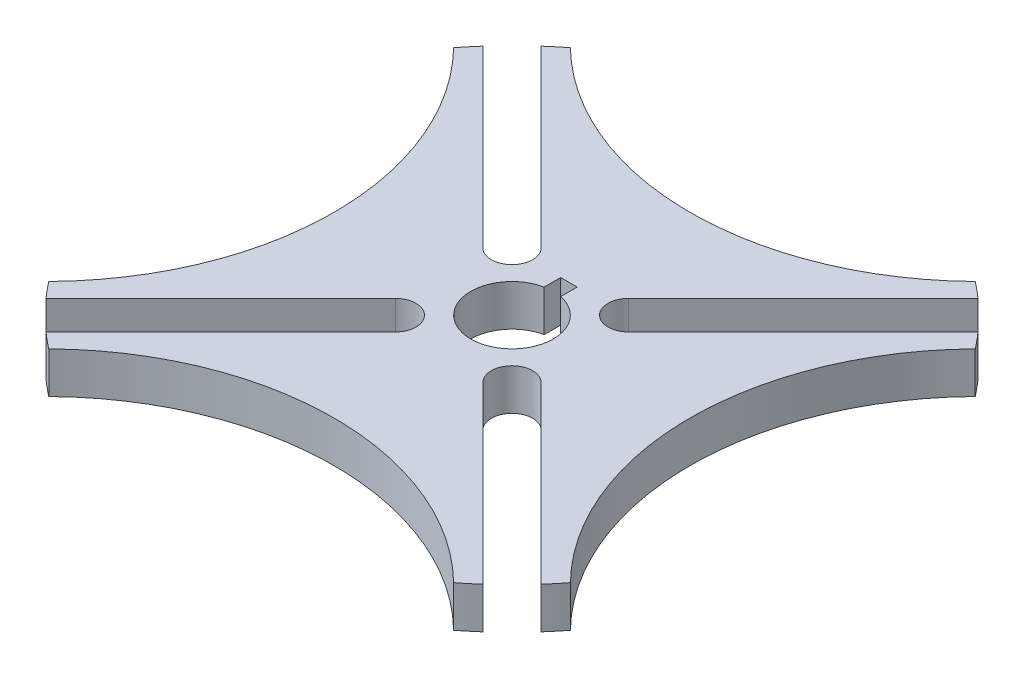
ISO-10303-21;
HEADER;
FILE_DESCRIPTION(('STEP AP214'),'2;1');
FILE_NAME('part.step','',(''),(''),'','','');
FILE_SCHEMA(('AUTOMOTIVE_DESIGN { 1 0 10303 214 1 1 1 1 }'));
ENDSEC;
DATA;
#1=APPLICATION_CONTEXT('core data for automotive mechanical design processes');
#2=APPLICATION_PROTOCOL_DEFINITION('international standard','automotive_design',2000,#1);
#3=PRODUCT_CONTEXT('',#1,'mechanical');
#4=PRODUCT('Part','Part','',(#3));
#5=PRODUCT_RELATED_PRODUCT_CATEGORY('part','',(#4));
#6=PRODUCT_DEFINITION_FORMATION('','',#4);
#7=PRODUCT_DEFINITION_CONTEXT('part definition',#1,'design');
#8=PRODUCT_DEFINITION('design','',#6,#7);
#9=PRODUCT_DEFINITION_SHAPE('','',#8);
#10=(LENGTH_UNIT() NAMED_UNIT(*) SI_UNIT(.MILLI.,.METRE.));
#11=(NAMED_UNIT(*) PLANE_ANGLE_UNIT() SI_UNIT($,.RADIAN.));
#12=(NAMED_UNIT(*) SI_UNIT($,.STERADIAN.) SOLID_ANGLE_UNIT());
#13=UNCERTAINTY_MEASURE_WITH_UNIT(LENGTH_MEASURE(1.E-05),#10,'distance_accuracy_value','');
#14=(GEOMETRIC_REPRESENTATION_CONTEXT(3) GLOBAL_UNCERTAINTY_ASSIGNED_CONTEXT((#13)) GLOBAL_UNIT_ASSIGNED_CONTEXT((#10,
#11,#12)) REPRESENTATION_CONTEXT('',''));
#15=CARTESIAN_POINT('',(0.,0.,0.));
#16=DIRECTION('',(0.,0.,1.));
#17=DIRECTION('',(1.,0.,0.));
#18=AXIS2_PLACEMENT_3D('',#15,#16,#17);
#19=CARTESIAN_POINT('',(0.,10.,0.));
#20=DIRECTION('',(0.,1.,0.));
#21=DIRECTION('',(0.,0.,1.));
#22=AXIS2_PLACEMENT_3D('',#19,#20,#21);
#23=PLANE('',#22);
#24=CARTESIAN_POINT('',(0.,10.,0.));
#25=DIRECTION('',(0.,1.,0.));
#26=DIRECTION('',(0.,0.,1.));
#27=AXIS2_PLACEMENT_3D('',#24,#25,#26);
#28=CIRCLE('',#27,80.);
#29=CARTESIAN_POINT('',(-49.0515513203566,10.,-63.1976685730291));
#30=VERTEX_POINT('',#29);
#31=CARTESIAN_POINT('',(-52.9224150472485,10.,-59.9934828591137));
#32=VERTEX_POINT('',#31);
#33=EDGE_CURVE('E256',#30,#32,#28,.T.);
#34=ORIENTED_EDGE('',*,*,#33,.T.);
#35=DIRECTION('',(0.707106781186551,0.,0.707106781186544));
#36=VECTOR('',#35,1.);
#37=CARTESIAN_POINT('',(-52.9224150472485,10.,-59.9934828591137));
#38=LINE('',#37,#36);
#39=CARTESIAN_POINT('',(-10.6066017177982,10.,-17.6776695296638));
#40=VERTEX_POINT('',#39);
#41=EDGE_CURVE('E259',#32,#40,#38,.T.);
#42=ORIENTED_EDGE('',*,*,#41,.T.);
#43=CARTESIAN_POINT('',(-14.142135623731,10.,-14.1421356237309));
#44=DIRECTION('',(0.,-1.,0.));
#45=DIRECTION('',(0.,0.,1.));
#46=AXIS2_PLACEMENT_3D('',#43,#44,#45);
#47=CIRCLE('',#46,5.00000000000016);
#48=CARTESIAN_POINT('',(-17.6776695296637,10.,-10.6066017177979));
#49=VERTEX_POINT('',#48);
#50=EDGE_CURVE('E262',#40,#49,#47,.T.);
#51=ORIENTED_EDGE('',*,*,#50,.T.);
#52=DIRECTION('',(-0.707106781186547,0.,-0.707106781186548));
#53=VECTOR('',#52,1.);
#54=CARTESIAN_POINT('',(-59.9934828591139,10.,-52.9224150472482));
#55=LINE('',#54,#53);
#56=CARTESIAN_POINT('',(-59.9934828591139,10.,-52.9224150472482));
#57=VERTEX_POINT('',#56);
#58=EDGE_CURVE('E264',#49,#57,#55,.T.);
#59=ORIENTED_EDGE('',*,*,#58,.T.);
#60=CARTESIAN_POINT('',(0.,10.,0.));
#61=DIRECTION('',(0.,1.,0.));
#62=DIRECTION('',(0.,0.,1.));
#63=AXIS2_PLACEMENT_3D('',#60,#61,#62);
#64=CIRCLE('',#63,80.);
#65=CARTESIAN_POINT('',(-63.197668573029,10.,-49.0515513203566));
#66=VERTEX_POINT('',#65);
#67=EDGE_CURVE('E266',#57,#66,#64,.T.);
#68=ORIENTED_EDGE('',*,*,#67,.T.);
#69=CARTESIAN_POINT('',(-113.137085,10.,0.));
#70=DIRECTION('',(0.,-1.,0.));
#71=DIRECTION('',(0.,0.,1.));
#72=AXIS2_PLACEMENT_3D('',#69,#70,#71);
#73=CIRCLE('',#72,70.);
#74=CARTESIAN_POINT('',(-63.197668573029,10.,49.0515513203567));
#75=VERTEX_POINT('',#74);
#76=EDGE_CURVE('E268',#66,#75,#73,.T.);
#77=ORIENTED_EDGE('',*,*,#76,.T.);
#78=CARTESIAN_POINT('',(0.,10.,0.));
#79=DIRECTION('',(0.,1.,0.));
#80=DIRECTION('',(0.,0.,1.));
#81=AXIS2_PLACEMENT_3D('',#78,#79,#80);
#82=CIRCLE('',#81,80.);
#83=CARTESIAN_POINT('',(-59.9934828591143,10.,52.9224150472478));
#84=VERTEX_POINT('',#83);
#85=EDGE_CURVE('E270',#75,#84,#82,.T.);
#86=ORIENTED_EDGE('',*,*,#85,.T.);
#87=DIRECTION('',(0.707106781186553,0.,-0.707106781186542));
#88=VECTOR('',#87,1.);
#89=CARTESIAN_POINT('',(-59.9934828591143,10.,52.9224150472478));
#90=LINE('',#89,#88);
#91=CARTESIAN_POINT('',(-17.6776695296638,10.,10.6066017177981));
#92=VERTEX_POINT('',#91);
#93=EDGE_CURVE('E272',#84,#92,#90,.T.);
#94=ORIENTED_EDGE('',*,*,#93,.T.);
#95=CARTESIAN_POINT('',(-14.1421356237311,10.,14.1421356237308));
#96=DIRECTION('',(0.,-1.,0.));
#97=DIRECTION('',(0.,0.,1.));
#98=AXIS2_PLACEMENT_3D('',#95,#96,#97);
#99=CIRCLE('',#98,5.00000000000001);
#100=CARTESIAN_POINT('',(-10.6066017177984,10.,17.6776695296636));
#101=VERTEX_POINT('',#100);
#102=EDGE_CURVE('E274',#92,#101,#99,.T.);
#103=ORIENTED_EDGE('',*,*,#102,.T.);
#104=DIRECTION('',(-0.707106781186553,0.,0.707106781186542));
#105=VECTOR('',#104,1.);
#106=CARTESIAN_POINT('',(-52.9224150472488,10.,59.9934828591134));
#107=LINE('',#106,#105);
#108=CARTESIAN_POINT('',(-52.9224150472488,10.,59.9934828591134));
#109=VERTEX_POINT('',#108);
#110=EDGE_CURVE('E276',#101,#109,#107,.T.);
#111=ORIENTED_EDGE('',*,*,#110,.T.);
#112=CARTESIAN_POINT('',(0.,10.,0.));
#113=DIRECTION('',(0.,1.,0.));
#114=DIRECTION('',(0.,0.,1.));
#115=AXIS2_PLACEMENT_3D('',#112,#113,#114);
#116=CIRCLE('',#115,80.);
#117=CARTESIAN_POINT('',(-49.0515513203566,10.,63.1976685730291));
#118=VERTEX_POINT('',#117);
#119=EDGE_CURVE('E278',#109,#118,#116,.T.);
#120=ORIENTED_EDGE('',*,*,#119,.T.);
#121=CARTESIAN_POINT('',(0.,10.,113.137085));
#122=DIRECTION('',(0.,-1.,0.));
#123=DIRECTION('',(0.,0.,1.));
#124=AXIS2_PLACEMENT_3D('',#121,#122,#123);
#125=CIRCLE('',#124,70.);
#126=CARTESIAN_POINT('',(49.0515513203566,10.,63.1976685730291));
#127=VERTEX_POINT('',#126);
#128=EDGE_CURVE('E280',#118,#127,#125,.T.);
#129=ORIENTED_EDGE('',*,*,#128,.T.);
#130=CARTESIAN_POINT('',(0.,10.,0.));
#131=DIRECTION('',(0.,1.,0.));
#132=DIRECTION('',(0.,0.,1.));
#133=AXIS2_PLACEMENT_3D('',#130,#131,#132);
#134=CIRCLE('',#133,80.);
#135=CARTESIAN_POINT('',(52.922415047248,10.,59.9934828591141));
#136=VERTEX_POINT('',#135);
#137=EDGE_CURVE('E282',#127,#136,#134,.T.);
#138=ORIENTED_EDGE('',*,*,#137,.T.);
#139=DIRECTION('',(-0.707106781186551,0.,-0.707106781186544));
#140=VECTOR('',#139,1.);
#141=CARTESIAN_POINT('',(52.922415047248,10.,59.9934828591141));
#142=LINE('',#141,#140);
#143=CARTESIAN_POINT('',(10.6066017177977,10.,17.6776695296642));
#144=VERTEX_POINT('',#143);
#145=EDGE_CURVE('E284',#136,#144,#142,.T.);
#146=ORIENTED_EDGE('',*,*,#145,.T.);
#147=CARTESIAN_POINT('',(14.1421356237338,10.,14.1421356237289));
#148=DIRECTION('',(0.,-1.,0.));
#149=DIRECTION('',(0.,0.,1.));
#150=AXIS2_PLACEMENT_3D('',#147,#148,#149);
#151=CIRCLE('',#150,5.00000000000029);
#152=CARTESIAN_POINT('',(17.6776695296664,10.,10.6066017177956));
#153=VERTEX_POINT('',#152);
#154=EDGE_CURVE('E286',#144,#153,#151,.T.);
#155=ORIENTED_EDGE('',*,*,#154,.T.);
#156=DIRECTION('',(0.707106781186544,0.,0.707106781186551));
#157=VECTOR('',#156,1.);
#158=CARTESIAN_POINT('',(59.9934828591136,10.,52.9224150472486));
#159=LINE('',#158,#157);
#160=CARTESIAN_POINT('',(59.9934828591136,10.,52.9224150472486));
#161=VERTEX_POINT('',#160);
#162=EDGE_CURVE('E288',#153,#161,#159,.T.);
#163=ORIENTED_EDGE('',*,*,#162,.T.);
#164=CARTESIAN_POINT('',(0.,10.,0.));
#165=DIRECTION('',(0.,1.,0.));
#166=DIRECTION('',(0.,0.,1.));
#167=AXIS2_PLACEMENT_3D('',#164,#165,#166);
#168=CIRCLE('',#167,80.);
#169=CARTESIAN_POINT('',(63.1976685730288,10.,49.0515513203569));
#170=VERTEX_POINT('',#169);
#171=EDGE_CURVE('E290',#161,#170,#168,.T.);
#172=ORIENTED_EDGE('',*,*,#171,.T.);
#173=CARTESIAN_POINT('',(113.137085,10.,3.95174924900611E-13));
#174=DIRECTION('',(0.,-1.,0.));
#175=DIRECTION('',(0.,0.,1.));
#176=AXIS2_PLACEMENT_3D('',#173,#174,#175);
#177=CIRCLE('',#176,70.);
#178=CARTESIAN_POINT('',(63.1976685730292,10.,-49.0515513203564));
#179=VERTEX_POINT('',#178);
#180=EDGE_CURVE('E292',#170,#179,#177,.T.);
#181=ORIENTED_EDGE('',*,*,#180,.T.);
#182=CARTESIAN_POINT('',(0.,10.,0.));
#183=DIRECTION('',(0.,1.,0.));
#184=DIRECTION('',(0.,0.,1.));
#185=AXIS2_PLACEMENT_3D('',#182,#183,#184);
#186=CIRCLE('',#185,80.);
#187=CARTESIAN_POINT('',(59.9934828591139,10.,-52.9224150472483));
#188=VERTEX_POINT('',#187);
#189=EDGE_CURVE('E294',#179,#188,#186,.T.);
#190=ORIENTED_EDGE('',*,*,#189,.T.);
#191=DIRECTION('',(-0.707106781186548,0.,0.707106781186547));
#192=VECTOR('',#191,1.);
#193=CARTESIAN_POINT('',(59.9934828591139,10.,-52.9224150472483));
#194=LINE('',#193,#192);
#195=CARTESIAN_POINT('',(17.6776695296637,10.,-10.6066017177982));
#196=VERTEX_POINT('',#195);
#197=EDGE_CURVE('E296',#188,#196,#194,.T.);
#198=ORIENTED_EDGE('',*,*,#197,.T.);
#199=CARTESIAN_POINT('',(14.142135623731,10.,-14.1421356237309));
#200=DIRECTION('',(0.,-1.,0.));
#201=DIRECTION('',(0.,0.,1.));
#202=AXIS2_PLACEMENT_3D('',#199,#200,#201);
#203=CIRCLE('',#202,5.00000000000001);
#204=CARTESIAN_POINT('',(10.6066017177982,10.,-17.6776695296637));
#205=VERTEX_POINT('',#204);
#206=EDGE_CURVE('E298',#196,#205,#203,.T.);
#207=ORIENTED_EDGE('',*,*,#206,.T.);
#208=DIRECTION('',(0.707106781186548,0.,-0.707106781186547));
#209=VECTOR('',#208,1.);
#210=CARTESIAN_POINT('',(52.9224150472484,10.,-59.9934828591138));
#211=LINE('',#210,#209);
#212=CARTESIAN_POINT('',(52.9224150472484,10.,-59.9934828591138));
#213=VERTEX_POINT('',#212);
#214=EDGE_CURVE('E300',#205,#213,#211,.T.);
#215=ORIENTED_EDGE('',*,*,#214,.T.);
#216=CARTESIAN_POINT('',(0.,10.,0.));
#217=DIRECTION('',(0.,1.,0.));
#218=DIRECTION('',(0.,0.,1.));
#219=AXIS2_PLACEMENT_3D('',#216,#217,#218);
#220=CIRCLE('',#219,80.);
#221=CARTESIAN_POINT('',(49.0515513203566,10.,-63.1976685730291));
#222=VERTEX_POINT('',#221);
#223=EDGE_CURVE('E302',#213,#222,#220,.T.);
#224=ORIENTED_EDGE('',*,*,#223,.T.);
#225=CARTESIAN_POINT('',(0.,10.,-113.137085));
#226=DIRECTION('',(0.,-1.,0.));
#227=DIRECTION('',(0.,0.,1.));
#228=AXIS2_PLACEMENT_3D('',#225,#226,#227);
#229=CIRCLE('',#228,70.);
#230=EDGE_CURVE('E304',#222,#30,#229,.T.);
#231=ORIENTED_EDGE('',*,*,#230,.T.);
#232=EDGE_LOOP('',(#34,#42,#51,#59,#68,#77,#86,#94,#103,#111,#120,#129,#138,#146,#155,#163,#172,
#181,#190,#198,#207,#215,#224,#231));
#233=FACE_BOUND('',#232,.T.);
#234=DIRECTION('',(0.,0.,-1.));
#235=VECTOR('',#234,1.);
#236=CARTESIAN_POINT('',(2.,10.,-9.79795897113271));
#237=LINE('',#236,#235);
#238=CARTESIAN_POINT('',(2.,10.,-9.79795897113271));
#239=VERTEX_POINT('',#238);
#240=CARTESIAN_POINT('',(2.,10.,-13.7979589711327));
#241=VERTEX_POINT('',#240);
#242=EDGE_CURVE('E228',#239,#241,#237,.T.);
#243=ORIENTED_EDGE('',*,*,#242,.F.);
#244=CARTESIAN_POINT('',(0.,10.,0.));
#245=DIRECTION('',(0.,1.,0.));
#246=DIRECTION('',(0.,0.,1.));
#247=AXIS2_PLACEMENT_3D('',#244,#245,#246);
#248=CIRCLE('',#247,10.);
#249=CARTESIAN_POINT('',(-2.,10.,-9.79795897113271));
#250=VERTEX_POINT('',#249);
#251=EDGE_CURVE('E220',#250,#239,#248,.T.);
#252=ORIENTED_EDGE('',*,*,#251,.F.);
#253=DIRECTION('',(0.,0.,1.));
#254=VECTOR('',#253,1.);
#255=CARTESIAN_POINT('',(-2.,10.,-9.79795897113271));
#256=LINE('',#255,#254);
#257=CARTESIAN_POINT('',(-2.,10.,-13.7979589711327));
#258=VERTEX_POINT('',#257);
#259=EDGE_CURVE('E242',#258,#250,#256,.T.);
#260=ORIENTED_EDGE('',*,*,#259,.F.);
#261=DIRECTION('',(-1.,0.,0.));
#262=VECTOR('',#261,1.);
#263=CARTESIAN_POINT('',(-2.,10.,-13.7979589711327));
#264=LINE('',#263,#262);
#265=EDGE_CURVE('E240',#241,#258,#264,.T.);
#266=ORIENTED_EDGE('',*,*,#265,.F.);
#267=EDGE_LOOP('',(#243,#252,#260,#266));
#268=FACE_BOUND('',#267,.T.);
#269=ADVANCED_FACE('F35',(#233,#268),#23,.T.);
#270=CARTESIAN_POINT('',(0.,0.,0.));
#271=DIRECTION('',(0.,1.,0.));
#272=DIRECTION('',(0.,0.,1.));
#273=AXIS2_PLACEMENT_3D('',#270,#271,#272);
#274=PLANE('',#273);
#275=CARTESIAN_POINT('',(0.,0.,0.));
#276=DIRECTION('',(0.,1.,0.));
#277=DIRECTION('',(0.,0.,1.));
#278=AXIS2_PLACEMENT_3D('',#275,#276,#277);
#279=CIRCLE('',#278,80.);
#280=CARTESIAN_POINT('',(-49.0515513203566,0.,-63.1976685730291));
#281=VERTEX_POINT('',#280);
#282=CARTESIAN_POINT('',(-52.9224150472485,0.,-59.9934828591137));
#283=VERTEX_POINT('',#282);
#284=EDGE_CURVE('E236',#281,#283,#279,.T.);
#285=ORIENTED_EDGE('',*,*,#284,.F.);
#286=CARTESIAN_POINT('',(0.,0.,-113.137085));
#287=DIRECTION('',(0.,-1.,0.));
#288=DIRECTION('',(0.,0.,1.));
#289=AXIS2_PLACEMENT_3D('',#286,#287,#288);
#290=CIRCLE('',#289,70.);
#291=CARTESIAN_POINT('',(49.0515513203566,0.,-63.1976685730291));
#292=VERTEX_POINT('',#291);
#293=EDGE_CURVE('E260',#292,#281,#290,.T.);
#294=ORIENTED_EDGE('',*,*,#293,.F.);
#295=CARTESIAN_POINT('',(0.,0.,0.));
#296=DIRECTION('',(0.,1.,0.));
#297=DIRECTION('',(0.,0.,1.));
#298=AXIS2_PLACEMENT_3D('',#295,#296,#297);
#299=CIRCLE('',#298,80.);
#300=CARTESIAN_POINT('',(52.9224150472484,0.,-59.9934828591138));
#301=VERTEX_POINT('',#300);
#302=EDGE_CURVE('E351',#301,#292,#299,.T.);
#303=ORIENTED_EDGE('',*,*,#302,.F.);
#304=DIRECTION('',(0.707106781186548,0.,-0.707106781186547));
#305=VECTOR('',#304,1.);
#306=CARTESIAN_POINT('',(52.9224150472484,0.,-59.9934828591138));
#307=LINE('',#306,#305);
#308=CARTESIAN_POINT('',(10.6066017177982,0.,-17.6776695296637));
#309=VERTEX_POINT('',#308);
#310=EDGE_CURVE('E349',#309,#301,#307,.T.);
#311=ORIENTED_EDGE('',*,*,#310,.F.);
#312=CARTESIAN_POINT('',(14.142135623731,0.,-14.1421356237309));
#313=DIRECTION('',(0.,-1.,0.));
#314=DIRECTION('',(0.,0.,1.));
#315=AXIS2_PLACEMENT_3D('',#312,#313,#314);
#316=CIRCLE('',#315,5.00000000000001);
#317=CARTESIAN_POINT('',(17.6776695296637,0.,-10.6066017177982));
#318=VERTEX_POINT('',#317);
#319=EDGE_CURVE('E347',#318,#309,#316,.T.);
#320=ORIENTED_EDGE('',*,*,#319,.F.);
#321=DIRECTION('',(-0.707106781186548,0.,0.707106781186547));
#322=VECTOR('',#321,1.);
#323=CARTESIAN_POINT('',(59.9934828591139,0.,-52.9224150472483));
#324=LINE('',#323,#322);
#325=CARTESIAN_POINT('',(59.9934828591139,0.,-52.9224150472483));
#326=VERTEX_POINT('',#325);
#327=EDGE_CURVE('E345',#326,#318,#324,.T.);
#328=ORIENTED_EDGE('',*,*,#327,.F.);
#329=CARTESIAN_POINT('',(0.,0.,0.));
#330=DIRECTION('',(0.,1.,0.));
#331=DIRECTION('',(0.,0.,1.));
#332=AXIS2_PLACEMENT_3D('',#329,#330,#331);
#333=CIRCLE('',#332,80.);
#334=CARTESIAN_POINT('',(63.1976685730292,0.,-49.0515513203564));
#335=VERTEX_POINT('',#334);
#336=EDGE_CURVE('E343',#335,#326,#333,.T.);
#337=ORIENTED_EDGE('',*,*,#336,.F.);
#338=CARTESIAN_POINT('',(113.137085,0.,3.95174924900611E-13));
#339=DIRECTION('',(0.,-1.,0.));
#340=DIRECTION('',(0.,0.,1.));
#341=AXIS2_PLACEMENT_3D('',#338,#339,#340);
#342=CIRCLE('',#341,70.);
#343=CARTESIAN_POINT('',(63.1976685730288,0.,49.0515513203569));
#344=VERTEX_POINT('',#343);
#345=EDGE_CURVE('E341',#344,#335,#342,.T.);
#346=ORIENTED_EDGE('',*,*,#345,.F.);
#347=CARTESIAN_POINT('',(0.,0.,0.));
#348=DIRECTION('',(0.,1.,0.));
#349=DIRECTION('',(0.,0.,1.));
#350=AXIS2_PLACEMENT_3D('',#347,#348,#349);
#351=CIRCLE('',#350,80.);
#352=CARTESIAN_POINT('',(59.9934828591136,0.,52.9224150472486));
#353=VERTEX_POINT('',#352);
#354=EDGE_CURVE('E339',#353,#344,#351,.T.);
#355=ORIENTED_EDGE('',*,*,#354,.F.);
#356=DIRECTION('',(0.707106781186544,0.,0.707106781186551));
#357=VECTOR('',#356,1.);
#358=CARTESIAN_POINT('',(59.9934828591136,0.,52.9224150472486));
#359=LINE('',#358,#357);
#360=CARTESIAN_POINT('',(17.6776695296664,0.,10.6066017177956));
#361=VERTEX_POINT('',#360);
#362=EDGE_CURVE('E337',#361,#353,#359,.T.);
#363=ORIENTED_EDGE('',*,*,#362,.F.);
#364=CARTESIAN_POINT('',(14.1421356237338,0.,14.1421356237289));
#365=DIRECTION('',(0.,-1.,0.));
#366=DIRECTION('',(0.,0.,1.));
#367=AXIS2_PLACEMENT_3D('',#364,#365,#366);
#368=CIRCLE('',#367,5.00000000000029);
#369=CARTESIAN_POINT('',(10.6066017177977,0.,17.6776695296642));
#370=VERTEX_POINT('',#369);
#371=EDGE_CURVE('E335',#370,#361,#368,.T.);
#372=ORIENTED_EDGE('',*,*,#371,.F.);
#373=DIRECTION('',(-0.707106781186551,0.,-0.707106781186544));
#374=VECTOR('',#373,1.);
#375=CARTESIAN_POINT('',(52.922415047248,0.,59.9934828591141));
#376=LINE('',#375,#374);
#377=CARTESIAN_POINT('',(52.922415047248,0.,59.9934828591141));
#378=VERTEX_POINT('',#377);
#379=EDGE_CURVE('E333',#378,#370,#376,.T.);
#380=ORIENTED_EDGE('',*,*,#379,.F.);
#381=CARTESIAN_POINT('',(0.,0.,0.));
#382=DIRECTION('',(0.,1.,0.));
#383=DIRECTION('',(0.,0.,1.));
#384=AXIS2_PLACEMENT_3D('',#381,#382,#383);
#385=CIRCLE('',#384,80.);
#386=CARTESIAN_POINT('',(49.0515513203566,0.,63.1976685730291));
#387=VERTEX_POINT('',#386);
#388=EDGE_CURVE('E331',#387,#378,#385,.T.);
#389=ORIENTED_EDGE('',*,*,#388,.F.);
#390=CARTESIAN_POINT('',(0.,0.,113.137085));
#391=DIRECTION('',(0.,-1.,0.));
#392=DIRECTION('',(0.,0.,1.));
#393=AXIS2_PLACEMENT_3D('',#390,#391,#392);
#394=CIRCLE('',#393,70.);
#395=CARTESIAN_POINT('',(-49.0515513203566,0.,63.1976685730291));
#396=VERTEX_POINT('',#395);
#397=EDGE_CURVE('E329',#396,#387,#394,.T.);
#398=ORIENTED_EDGE('',*,*,#397,.F.);
#399=CARTESIAN_POINT('',(0.,0.,0.));
#400=DIRECTION('',(0.,1.,0.));
#401=DIRECTION('',(0.,0.,1.));
#402=AXIS2_PLACEMENT_3D('',#399,#400,#401);
#403=CIRCLE('',#402,80.);
#404=CARTESIAN_POINT('',(-52.9224150472488,0.,59.9934828591134));
#405=VERTEX_POINT('',#404);
#406=EDGE_CURVE('E327',#405,#396,#403,.T.);
#407=ORIENTED_EDGE('',*,*,#406,.F.);
#408=DIRECTION('',(-0.707106781186553,0.,0.707106781186542));
#409=VECTOR('',#408,1.);
#410=CARTESIAN_POINT('',(-52.9224150472488,0.,59.9934828591134));
#411=LINE('',#410,#409);
#412=CARTESIAN_POINT('',(-10.6066017177984,0.,17.6776695296636));
#413=VERTEX_POINT('',#412);
#414=EDGE_CURVE('E325',#413,#405,#411,.T.);
#415=ORIENTED_EDGE('',*,*,#414,.F.);
#416=CARTESIAN_POINT('',(-14.1421356237311,0.,14.1421356237308));
#417=DIRECTION('',(0.,-1.,0.));
#418=DIRECTION('',(0.,0.,1.));
#419=AXIS2_PLACEMENT_3D('',#416,#417,#418);
#420=CIRCLE('',#419,5.00000000000001);
#421=CARTESIAN_POINT('',(-17.6776695296638,0.,10.6066017177981));
#422=VERTEX_POINT('',#421);
#423=EDGE_CURVE('E323',#422,#413,#420,.T.);
#424=ORIENTED_EDGE('',*,*,#423,.F.);
#425=DIRECTION('',(0.707106781186553,0.,-0.707106781186542));
#426=VECTOR('',#425,1.);
#427=CARTESIAN_POINT('',(-59.9934828591143,0.,52.9224150472478));
#428=LINE('',#427,#426);
#429=CARTESIAN_POINT('',(-59.9934828591143,0.,52.9224150472478));
#430=VERTEX_POINT('',#429);
#431=EDGE_CURVE('E321',#430,#422,#428,.T.);
#432=ORIENTED_EDGE('',*,*,#431,.F.);
#433=CARTESIAN_POINT('',(0.,0.,0.));
#434=DIRECTION('',(0.,1.,0.));
#435=DIRECTION('',(0.,0.,1.));
#436=AXIS2_PLACEMENT_3D('',#433,#434,#435);
#437=CIRCLE('',#436,80.);
#438=CARTESIAN_POINT('',(-63.197668573029,0.,49.0515513203567));
#439=VERTEX_POINT('',#438);
#440=EDGE_CURVE('E319',#439,#430,#437,.T.);
#441=ORIENTED_EDGE('',*,*,#440,.F.);
#442=CARTESIAN_POINT('',(-113.137085,0.,0.));
#443=DIRECTION('',(0.,-1.,0.));
#444=DIRECTION('',(0.,0.,1.));
#445=AXIS2_PLACEMENT_3D('',#442,#443,#444);
#446=CIRCLE('',#445,70.);
#447=CARTESIAN_POINT('',(-63.197668573029,0.,-49.0515513203566));
#448=VERTEX_POINT('',#447);
#449=EDGE_CURVE('E317',#448,#439,#446,.T.);
#450=ORIENTED_EDGE('',*,*,#449,.F.);
#451=CARTESIAN_POINT('',(0.,0.,0.));
#452=DIRECTION('',(0.,1.,0.));
#453=DIRECTION('',(0.,0.,1.));
#454=AXIS2_PLACEMENT_3D('',#451,#452,#453);
#455=CIRCLE('',#454,80.);
#456=CARTESIAN_POINT('',(-59.9934828591139,0.,-52.9224150472482));
#457=VERTEX_POINT('',#456);
#458=EDGE_CURVE('E315',#457,#448,#455,.T.);
#459=ORIENTED_EDGE('',*,*,#458,.F.);
#460=DIRECTION('',(-0.707106781186547,0.,-0.707106781186548));
#461=VECTOR('',#460,1.);
#462=CARTESIAN_POINT('',(-59.9934828591139,0.,-52.9224150472482));
#463=LINE('',#462,#461);
#464=CARTESIAN_POINT('',(-17.6776695296637,0.,-10.6066017177979));
#465=VERTEX_POINT('',#464);
#466=EDGE_CURVE('E313',#465,#457,#463,.T.);
#467=ORIENTED_EDGE('',*,*,#466,.F.);
#468=CARTESIAN_POINT('',(-14.142135623731,0.,-14.1421356237309));
#469=DIRECTION('',(0.,-1.,0.));
#470=DIRECTION('',(0.,0.,1.));
#471=AXIS2_PLACEMENT_3D('',#468,#469,#470);
#472=CIRCLE('',#471,5.00000000000016);
#473=CARTESIAN_POINT('',(-10.6066017177982,0.,-17.6776695296638));
#474=VERTEX_POINT('',#473);
#475=EDGE_CURVE('E311',#474,#465,#472,.T.);
#476=ORIENTED_EDGE('',*,*,#475,.F.);
#477=DIRECTION('',(0.707106781186551,0.,0.707106781186544));
#478=VECTOR('',#477,1.);
#479=CARTESIAN_POINT('',(-52.9224150472485,0.,-59.9934828591137));
#480=LINE('',#479,#478);
#481=EDGE_CURVE('E309',#283,#474,#480,.T.);
#482=ORIENTED_EDGE('',*,*,#481,.F.);
#483=EDGE_LOOP('',(#285,#294,#303,#311,#320,#328,#337,#346,#355,#363,#372,#380,#389,#398,#407,
#415,#424,#432,#441,#450,#459,#467,#476,#482));
#484=FACE_BOUND('',#483,.T.);
#485=CARTESIAN_POINT('',(0.,0.,0.));
#486=DIRECTION('',(0.,1.,0.));
#487=DIRECTION('',(0.,0.,1.));
#488=AXIS2_PLACEMENT_3D('',#485,#486,#487);
#489=CIRCLE('',#488,10.);
#490=CARTESIAN_POINT('',(-2.,0.,-9.79795897113271));
#491=VERTEX_POINT('',#490);
#492=CARTESIAN_POINT('',(2.,0.,-9.79795897113271));
#493=VERTEX_POINT('',#492);
#494=EDGE_CURVE('E58',#491,#493,#489,.T.);
#495=ORIENTED_EDGE('',*,*,#494,.T.);
#496=DIRECTION('',(0.,0.,-1.));
#497=VECTOR('',#496,1.);
#498=CARTESIAN_POINT('',(2.,0.,-9.79795897113271));
#499=LINE('',#498,#497);
#500=CARTESIAN_POINT('',(2.,0.,-13.7979589711327));
#501=VERTEX_POINT('',#500);
#502=EDGE_CURVE('E235',#493,#501,#499,.T.);
#503=ORIENTED_EDGE('',*,*,#502,.T.);
#504=DIRECTION('',(-1.,0.,0.));
#505=VECTOR('',#504,1.);
#506=CARTESIAN_POINT('',(-2.,0.,-13.7979589711327));
#507=LINE('',#506,#505);
#508=CARTESIAN_POINT('',(-2.,0.,-13.7979589711327));
#509=VERTEX_POINT('',#508);
#510=EDGE_CURVE('E248',#501,#509,#507,.T.);
#511=ORIENTED_EDGE('',*,*,#510,.T.);
#512=DIRECTION('',(0.,0.,1.));
#513=VECTOR('',#512,1.);
#514=CARTESIAN_POINT('',(-2.,0.,-9.79795897113271));
#515=LINE('',#514,#513);
#516=EDGE_CURVE('E229',#509,#491,#515,.T.);
#517=ORIENTED_EDGE('',*,*,#516,.T.);
#518=EDGE_LOOP('',(#495,#503,#511,#517));
#519=FACE_BOUND('',#518,.T.);
#520=ADVANCED_FACE('F429',(#484,#519),#274,.F.);
#521=CARTESIAN_POINT('',(0.,10.,0.));
#522=DIRECTION('',(0.,-1.,0.));
#523=DIRECTION('',(0.,0.,-1.));
#524=AXIS2_PLACEMENT_3D('',#521,#522,#523);
#525=CYLINDRICAL_SURFACE('',#524,80.);
#526=ORIENTED_EDGE('',*,*,#284,.T.);
#527=DIRECTION('',(0.,-1.,0.));
#528=VECTOR('',#527,1.);
#529=CARTESIAN_POINT('',(-52.9224150472485,10.,-59.9934828591137));
#530=LINE('',#529,#528);
#531=EDGE_CURVE('E11',#32,#283,#530,.T.);
#532=ORIENTED_EDGE('',*,*,#531,.F.);
#533=ORIENTED_EDGE('',*,*,#33,.F.);
#534=DIRECTION('',(0.,-1.,0.));
#535=VECTOR('',#534,1.);
#536=CARTESIAN_POINT('',(-49.0515513203566,10.,-63.1976685730291));
#537=LINE('',#536,#535);
#538=EDGE_CURVE('E306',#30,#281,#537,.T.);
#539=ORIENTED_EDGE('',*,*,#538,.T.);
#540=EDGE_LOOP('',(#526,#532,#533,#539));
#541=FACE_BOUND('',#540,.T.);
#542=ADVANCED_FACE('F37',(#541),#525,.T.);
#543=CARTESIAN_POINT('',(-52.9224150472485,10.,-59.9934828591137));
#544=DIRECTION('',(0.707106781186544,0.,-0.707106781186551));
#545=DIRECTION('',(-0.707106781186551,0.,-0.707106781186544));
#546=AXIS2_PLACEMENT_3D('',#543,#544,#545);
#547=PLANE('',#546);
#548=ORIENTED_EDGE('',*,*,#481,.T.);
#549=DIRECTION('',(0.,-1.,0.));
#550=VECTOR('',#549,1.);
#551=CARTESIAN_POINT('',(-10.6066017177982,10.,-17.6776695296638));
#552=LINE('',#551,#550);
#553=EDGE_CURVE('E43',#40,#474,#552,.T.);
#554=ORIENTED_EDGE('',*,*,#553,.F.);
#555=ORIENTED_EDGE('',*,*,#41,.F.);
#556=ORIENTED_EDGE('',*,*,#531,.T.);
#557=EDGE_LOOP('',(#548,#554,#555,#556));
#558=FACE_BOUND('',#557,.T.);
#559=ADVANCED_FACE('F446',(#558),#547,.F.);
#560=CARTESIAN_POINT('',(-14.142135623731,10.,-14.1421356237309));
#561=DIRECTION('',(0.,-1.,0.));
#562=DIRECTION('',(0.,0.,-1.));
#563=AXIS2_PLACEMENT_3D('',#560,#561,#562);
#564=CYLINDRICAL_SURFACE('',#563,5.00000000000016);
#565=ORIENTED_EDGE('',*,*,#475,.T.);
#566=DIRECTION('',(0.,-1.,0.));
#567=VECTOR('',#566,1.);
#568=CARTESIAN_POINT('',(-17.6776695296637,10.,-10.6066017177979));
#569=LINE('',#568,#567);
#570=EDGE_CURVE('E416',#49,#465,#569,.T.);
#571=ORIENTED_EDGE('',*,*,#570,.F.);
#572=ORIENTED_EDGE('',*,*,#50,.F.);
#573=ORIENTED_EDGE('',*,*,#553,.T.);
#574=EDGE_LOOP('',(#565,#571,#572,#573));
#575=FACE_BOUND('',#574,.T.);
#576=ADVANCED_FACE('F423',(#575),#564,.F.);
#577=CARTESIAN_POINT('',(-59.9934828591139,10.,-52.9224150472482));
#578=DIRECTION('',(-0.707106781186548,0.,0.707106781186547));
#579=DIRECTION('',(0.707106781186547,0.,0.707106781186548));
#580=AXIS2_PLACEMENT_3D('',#577,#578,#579);
#581=PLANE('',#580);
#582=ORIENTED_EDGE('',*,*,#466,.T.);
#583=DIRECTION('',(0.,-1.,0.));
#584=VECTOR('',#583,1.);
#585=CARTESIAN_POINT('',(-59.9934828591139,10.,-52.9224150472482));
#586=LINE('',#585,#584);
#587=EDGE_CURVE('E413',#57,#457,#586,.T.);
#588=ORIENTED_EDGE('',*,*,#587,.F.);
#589=ORIENTED_EDGE('',*,*,#58,.F.);
#590=ORIENTED_EDGE('',*,*,#570,.T.);
#591=EDGE_LOOP('',(#582,#588,#589,#590));
#592=FACE_BOUND('',#591,.T.);
#593=ADVANCED_FACE('F435',(#592),#581,.F.);
#594=CARTESIAN_POINT('',(0.,10.,0.));
#595=DIRECTION('',(0.,-1.,0.));
#596=DIRECTION('',(0.,0.,-1.));
#597=AXIS2_PLACEMENT_3D('',#594,#595,#596);
#598=CYLINDRICAL_SURFACE('',#597,80.);
#599=ORIENTED_EDGE('',*,*,#458,.T.);
#600=DIRECTION('',(0.,-1.,0.));
#601=VECTOR('',#600,1.);
#602=CARTESIAN_POINT('',(-63.197668573029,10.,-49.0515513203566));
#603=LINE('',#602,#601);
#604=EDGE_CURVE('E410',#66,#448,#603,.T.);
#605=ORIENTED_EDGE('',*,*,#604,.F.);
#606=ORIENTED_EDGE('',*,*,#67,.F.);
#607=ORIENTED_EDGE('',*,*,#587,.T.);
#608=EDGE_LOOP('',(#599,#605,#606,#607));
#609=FACE_BOUND('',#608,.T.);
#610=ADVANCED_FACE('F439',(#609),#598,.T.);
#611=CARTESIAN_POINT('',(-113.137085,10.,0.));
#612=DIRECTION('',(0.,-1.,0.));
#613=DIRECTION('',(0.,0.,-1.));
#614=AXIS2_PLACEMENT_3D('',#611,#612,#613);
#615=CYLINDRICAL_SURFACE('',#614,70.);
#616=ORIENTED_EDGE('',*,*,#449,.T.);
#617=DIRECTION('',(0.,-1.,0.));
#618=VECTOR('',#617,1.);
#619=CARTESIAN_POINT('',(-63.197668573029,10.,49.0515513203567));
#620=LINE('',#619,#618);
#621=EDGE_CURVE('E407',#75,#439,#620,.T.);
#622=ORIENTED_EDGE('',*,*,#621,.F.);
#623=ORIENTED_EDGE('',*,*,#76,.F.);
#624=ORIENTED_EDGE('',*,*,#604,.T.);
#625=EDGE_LOOP('',(#616,#622,#623,#624));
#626=FACE_BOUND('',#625,.T.);
#627=ADVANCED_FACE('F539',(#626),#615,.F.);
#628=CARTESIAN_POINT('',(0.,10.,0.));
#629=DIRECTION('',(0.,-1.,0.));
#630=DIRECTION('',(0.,0.,-1.));
#631=AXIS2_PLACEMENT_3D('',#628,#629,#630);
#632=CYLINDRICAL_SURFACE('',#631,80.);
#633=ORIENTED_EDGE('',*,*,#440,.T.);
#634=DIRECTION('',(0.,-1.,0.));
#635=VECTOR('',#634,1.);
#636=CARTESIAN_POINT('',(-59.9934828591143,10.,52.9224150472478));
#637=LINE('',#636,#635);
#638=EDGE_CURVE('E404',#84,#430,#637,.T.);
#639=ORIENTED_EDGE('',*,*,#638,.F.);
#640=ORIENTED_EDGE('',*,*,#85,.F.);
#641=ORIENTED_EDGE('',*,*,#621,.T.);
#642=EDGE_LOOP('',(#633,#639,#640,#641));
#643=FACE_BOUND('',#642,.T.);
#644=ADVANCED_FACE('F537',(#643),#632,.T.);
#645=CARTESIAN_POINT('',(-59.9934828591143,10.,52.9224150472478));
#646=DIRECTION('',(-0.707106781186542,0.,-0.707106781186553));
#647=DIRECTION('',(-0.707106781186553,0.,0.707106781186542));
#648=AXIS2_PLACEMENT_3D('',#645,#646,#647);
#649=PLANE('',#648);
#650=ORIENTED_EDGE('',*,*,#431,.T.);
#651=DIRECTION('',(0.,-1.,0.));
#652=VECTOR('',#651,1.);
#653=CARTESIAN_POINT('',(-17.6776695296638,10.,10.6066017177981));
#654=LINE('',#653,#652);
#655=EDGE_CURVE('E401',#92,#422,#654,.T.);
#656=ORIENTED_EDGE('',*,*,#655,.F.);
#657=ORIENTED_EDGE('',*,*,#93,.F.);
#658=ORIENTED_EDGE('',*,*,#638,.T.);
#659=EDGE_LOOP('',(#650,#656,#657,#658));
#660=FACE_BOUND('',#659,.T.);
#661=ADVANCED_FACE('F533',(#660),#649,.F.);
#662=CARTESIAN_POINT('',(-14.1421356237311,10.,14.1421356237308));
#663=DIRECTION('',(0.,-1.,0.));
#664=DIRECTION('',(0.,0.,-1.));
#665=AXIS2_PLACEMENT_3D('',#662,#663,#664);
#666=CYLINDRICAL_SURFACE('',#665,5.00000000000001);
#667=ORIENTED_EDGE('',*,*,#423,.T.);
#668=DIRECTION('',(0.,-1.,0.));
#669=VECTOR('',#668,1.);
#670=CARTESIAN_POINT('',(-10.6066017177984,10.,17.6776695296636));
#671=LINE('',#670,#669);
#672=EDGE_CURVE('E398',#101,#413,#671,.T.);
#673=ORIENTED_EDGE('',*,*,#672,.F.);
#674=ORIENTED_EDGE('',*,*,#102,.F.);
#675=ORIENTED_EDGE('',*,*,#655,.T.);
#676=EDGE_LOOP('',(#667,#673,#674,#675));
#677=FACE_BOUND('',#676,.T.);
#678=ADVANCED_FACE('F528',(#677),#666,.F.);
#679=CARTESIAN_POINT('',(-52.9224150472488,10.,59.9934828591134));
#680=DIRECTION('',(0.707106781186542,0.,0.707106781186553));
#681=DIRECTION('',(0.707106781186553,0.,-0.707106781186542));
#682=AXIS2_PLACEMENT_3D('',#679,#680,#681);
#683=PLANE('',#682);
#684=ORIENTED_EDGE('',*,*,#414,.T.);
#685=DIRECTION('',(0.,-1.,0.));
#686=VECTOR('',#685,1.);
#687=CARTESIAN_POINT('',(-52.9224150472488,10.,59.9934828591134));
#688=LINE('',#687,#686);
#689=EDGE_CURVE('E395',#109,#405,#688,.T.);
#690=ORIENTED_EDGE('',*,*,#689,.F.);
#691=ORIENTED_EDGE('',*,*,#110,.F.);
#692=ORIENTED_EDGE('',*,*,#672,.T.);
#693=EDGE_LOOP('',(#684,#690,#691,#692));
#694=FACE_BOUND('',#693,.T.);
#695=ADVANCED_FACE('F522',(#694),#683,.F.);
#696=CARTESIAN_POINT('',(0.,10.,0.));
#697=DIRECTION('',(0.,-1.,0.));
#698=DIRECTION('',(0.,0.,-1.));
#699=AXIS2_PLACEMENT_3D('',#696,#697,#698);
#700=CYLINDRICAL_SURFACE('',#699,80.);
#701=ORIENTED_EDGE('',*,*,#406,.T.);
#702=DIRECTION('',(0.,-1.,0.));
#703=VECTOR('',#702,1.);
#704=CARTESIAN_POINT('',(-49.0515513203566,10.,63.1976685730291));
#705=LINE('',#704,#703);
#706=EDGE_CURVE('E392',#118,#396,#705,.T.);
#707=ORIENTED_EDGE('',*,*,#706,.F.);
#708=ORIENTED_EDGE('',*,*,#119,.F.);
#709=ORIENTED_EDGE('',*,*,#689,.T.);
#710=EDGE_LOOP('',(#701,#707,#708,#709));
#711=FACE_BOUND('',#710,.T.);
#712=ADVANCED_FACE('F518',(#711),#700,.T.);
#713=CARTESIAN_POINT('',(0.,10.,113.137085));
#714=DIRECTION('',(0.,-1.,0.));
#715=DIRECTION('',(0.,0.,-1.));
#716=AXIS2_PLACEMENT_3D('',#713,#714,#715);
#717=CYLINDRICAL_SURFACE('',#716,70.);
#718=ORIENTED_EDGE('',*,*,#397,.T.);
#719=DIRECTION('',(0.,-1.,0.));
#720=VECTOR('',#719,1.);
#721=CARTESIAN_POINT('',(49.0515513203566,10.,63.1976685730291));
#722=LINE('',#721,#720);
#723=EDGE_CURVE('E389',#127,#387,#722,.T.);
#724=ORIENTED_EDGE('',*,*,#723,.F.);
#725=ORIENTED_EDGE('',*,*,#128,.F.);
#726=ORIENTED_EDGE('',*,*,#706,.T.);
#727=EDGE_LOOP('',(#718,#724,#725,#726));
#728=FACE_BOUND('',#727,.T.);
#729=ADVANCED_FACE('F513',(#728),#717,.F.);
#730=CARTESIAN_POINT('',(0.,10.,0.));
#731=DIRECTION('',(0.,-1.,0.));
#732=DIRECTION('',(0.,0.,-1.));
#733=AXIS2_PLACEMENT_3D('',#730,#731,#732);
#734=CYLINDRICAL_SURFACE('',#733,80.);
#735=ORIENTED_EDGE('',*,*,#388,.T.);
#736=DIRECTION('',(0.,-1.,0.));
#737=VECTOR('',#736,1.);
#738=CARTESIAN_POINT('',(52.922415047248,10.,59.9934828591141));
#739=LINE('',#738,#737);
#740=EDGE_CURVE('E386',#136,#378,#739,.T.);
#741=ORIENTED_EDGE('',*,*,#740,.F.);
#742=ORIENTED_EDGE('',*,*,#137,.F.);
#743=ORIENTED_EDGE('',*,*,#723,.T.);
#744=EDGE_LOOP('',(#735,#741,#742,#743));
#745=FACE_BOUND('',#744,.T.);
#746=ADVANCED_FACE('F507',(#745),#734,.T.);
#747=CARTESIAN_POINT('',(52.922415047248,10.,59.9934828591141));
#748=DIRECTION('',(-0.707106781186544,0.,0.707106781186551));
#749=DIRECTION('',(0.707106781186551,0.,0.707106781186544));
#750=AXIS2_PLACEMENT_3D('',#747,#748,#749);
#751=PLANE('',#750);
#752=ORIENTED_EDGE('',*,*,#379,.T.);
#753=DIRECTION('',(0.,-1.,0.));
#754=VECTOR('',#753,1.);
#755=CARTESIAN_POINT('',(10.6066017177977,10.,17.6776695296642));
#756=LINE('',#755,#754);
#757=EDGE_CURVE('E383',#144,#370,#756,.T.);
#758=ORIENTED_EDGE('',*,*,#757,.F.);
#759=ORIENTED_EDGE('',*,*,#145,.F.);
#760=ORIENTED_EDGE('',*,*,#740,.T.);
#761=EDGE_LOOP('',(#752,#758,#759,#760));
#762=FACE_BOUND('',#761,.T.);
#763=ADVANCED_FACE('F503',(#762),#751,.F.);
#764=CARTESIAN_POINT('',(14.1421356237338,10.,14.1421356237289));
#765=DIRECTION('',(0.,-1.,0.));
#766=DIRECTION('',(0.,0.,-1.));
#767=AXIS2_PLACEMENT_3D('',#764,#765,#766);
#768=CYLINDRICAL_SURFACE('',#767,5.00000000000029);
#769=ORIENTED_EDGE('',*,*,#371,.T.);
#770=DIRECTION('',(0.,-1.,0.));
#771=VECTOR('',#770,1.);
#772=CARTESIAN_POINT('',(17.6776695296664,10.,10.6066017177956));
#773=LINE('',#772,#771);
#774=EDGE_CURVE('E380',#153,#361,#773,.T.);
#775=ORIENTED_EDGE('',*,*,#774,.F.);
#776=ORIENTED_EDGE('',*,*,#154,.F.);
#777=ORIENTED_EDGE('',*,*,#757,.T.);
#778=EDGE_LOOP('',(#769,#775,#776,#777));
#779=FACE_BOUND('',#778,.T.);
#780=ADVANCED_FACE('F498',(#779),#768,.F.);
#781=CARTESIAN_POINT('',(59.9934828591136,10.,52.9224150472486));
#782=DIRECTION('',(0.707106781186551,0.,-0.707106781186544));
#783=DIRECTION('',(-0.707106781186544,0.,-0.707106781186551));
#784=AXIS2_PLACEMENT_3D('',#781,#782,#783);
#785=PLANE('',#784);
#786=ORIENTED_EDGE('',*,*,#362,.T.);
#787=DIRECTION('',(0.,-1.,0.));
#788=VECTOR('',#787,1.);
#789=CARTESIAN_POINT('',(59.9934828591136,10.,52.9224150472486));
#790=LINE('',#789,#788);
#791=EDGE_CURVE('E377',#161,#353,#790,.T.);
#792=ORIENTED_EDGE('',*,*,#791,.F.);
#793=ORIENTED_EDGE('',*,*,#162,.F.);
#794=ORIENTED_EDGE('',*,*,#774,.T.);
#795=EDGE_LOOP('',(#786,#792,#793,#794));
#796=FACE_BOUND('',#795,.T.);
#797=ADVANCED_FACE('F492',(#796),#785,.F.);
#798=CARTESIAN_POINT('',(0.,10.,0.));
#799=DIRECTION('',(0.,-1.,0.));
#800=DIRECTION('',(0.,0.,-1.));
#801=AXIS2_PLACEMENT_3D('',#798,#799,#800);
#802=CYLINDRICAL_SURFACE('',#801,80.);
#803=ORIENTED_EDGE('',*,*,#354,.T.);
#804=DIRECTION('',(0.,-1.,0.));
#805=VECTOR('',#804,1.);
#806=CARTESIAN_POINT('',(63.1976685730288,10.,49.0515513203569));
#807=LINE('',#806,#805);
#808=EDGE_CURVE('E374',#170,#344,#807,.T.);
#809=ORIENTED_EDGE('',*,*,#808,.F.);
#810=ORIENTED_EDGE('',*,*,#171,.F.);
#811=ORIENTED_EDGE('',*,*,#791,.T.);
#812=EDGE_LOOP('',(#803,#809,#810,#811));
#813=FACE_BOUND('',#812,.T.);
#814=ADVANCED_FACE('F488',(#813),#802,.T.);
#815=CARTESIAN_POINT('',(113.137085,10.,3.95174924900611E-13));
#816=DIRECTION('',(0.,-1.,0.));
#817=DIRECTION('',(0.,0.,-1.));
#818=AXIS2_PLACEMENT_3D('',#815,#816,#817);
#819=CYLINDRICAL_SURFACE('',#818,70.);
#820=ORIENTED_EDGE('',*,*,#345,.T.);
#821=DIRECTION('',(0.,-1.,0.));
#822=VECTOR('',#821,1.);
#823=CARTESIAN_POINT('',(63.1976685730292,10.,-49.0515513203564));
#824=LINE('',#823,#822);
#825=EDGE_CURVE('E371',#179,#335,#824,.T.);
#826=ORIENTED_EDGE('',*,*,#825,.F.);
#827=ORIENTED_EDGE('',*,*,#180,.F.);
#828=ORIENTED_EDGE('',*,*,#808,.T.);
#829=EDGE_LOOP('',(#820,#826,#827,#828));
#830=FACE_BOUND('',#829,.T.);
#831=ADVANCED_FACE('F483',(#830),#819,.F.);
#832=CARTESIAN_POINT('',(0.,10.,0.));
#833=DIRECTION('',(0.,-1.,0.));
#834=DIRECTION('',(0.,0.,-1.));
#835=AXIS2_PLACEMENT_3D('',#832,#833,#834);
#836=CYLINDRICAL_SURFACE('',#835,80.);
#837=ORIENTED_EDGE('',*,*,#336,.T.);
#838=DIRECTION('',(0.,-1.,0.));
#839=VECTOR('',#838,1.);
#840=CARTESIAN_POINT('',(59.9934828591139,10.,-52.9224150472483));
#841=LINE('',#840,#839);
#842=EDGE_CURVE('E368',#188,#326,#841,.T.);
#843=ORIENTED_EDGE('',*,*,#842,.F.);
#844=ORIENTED_EDGE('',*,*,#189,.F.);
#845=ORIENTED_EDGE('',*,*,#825,.T.);
#846=EDGE_LOOP('',(#837,#843,#844,#845));
#847=FACE_BOUND('',#846,.T.);
#848=ADVANCED_FACE('F477',(#847),#836,.T.);
#849=CARTESIAN_POINT('',(59.9934828591139,10.,-52.9224150472483));
#850=DIRECTION('',(0.707106781186547,0.,0.707106781186548));
#851=DIRECTION('',(0.707106781186548,0.,-0.707106781186547));
#852=AXIS2_PLACEMENT_3D('',#849,#850,#851);
#853=PLANE('',#852);
#854=ORIENTED_EDGE('',*,*,#327,.T.);
#855=DIRECTION('',(0.,-1.,0.));
#856=VECTOR('',#855,1.);
#857=CARTESIAN_POINT('',(17.6776695296637,10.,-10.6066017177982));
#858=LINE('',#857,#856);
#859=EDGE_CURVE('E365',#196,#318,#858,.T.);
#860=ORIENTED_EDGE('',*,*,#859,.F.);
#861=ORIENTED_EDGE('',*,*,#197,.F.);
#862=ORIENTED_EDGE('',*,*,#842,.T.);
#863=EDGE_LOOP('',(#854,#860,#861,#862));
#864=FACE_BOUND('',#863,.T.);
#865=ADVANCED_FACE('F473',(#864),#853,.F.);
#866=CARTESIAN_POINT('',(14.142135623731,10.,-14.1421356237309));
#867=DIRECTION('',(0.,-1.,0.));
#868=DIRECTION('',(0.,0.,-1.));
#869=AXIS2_PLACEMENT_3D('',#866,#867,#868);
#870=CYLINDRICAL_SURFACE('',#869,5.00000000000001);
#871=ORIENTED_EDGE('',*,*,#319,.T.);
#872=DIRECTION('',(0.,-1.,0.));
#873=VECTOR('',#872,1.);
#874=CARTESIAN_POINT('',(10.6066017177982,10.,-17.6776695296637));
#875=LINE('',#874,#873);
#876=EDGE_CURVE('E362',#205,#309,#875,.T.);
#877=ORIENTED_EDGE('',*,*,#876,.F.);
#878=ORIENTED_EDGE('',*,*,#206,.F.);
#879=ORIENTED_EDGE('',*,*,#859,.T.);
#880=EDGE_LOOP('',(#871,#877,#878,#879));
#881=FACE_BOUND('',#880,.T.);
#882=ADVANCED_FACE('F468',(#881),#870,.F.);
#883=CARTESIAN_POINT('',(52.9224150472484,10.,-59.9934828591138));
#884=DIRECTION('',(-0.707106781186547,0.,-0.707106781186548));
#885=DIRECTION('',(-0.707106781186548,0.,0.707106781186547));
#886=AXIS2_PLACEMENT_3D('',#883,#884,#885);
#887=PLANE('',#886);
#888=ORIENTED_EDGE('',*,*,#310,.T.);
#889=DIRECTION('',(0.,-1.,0.));
#890=VECTOR('',#889,1.);
#891=CARTESIAN_POINT('',(52.9224150472484,10.,-59.9934828591138));
#892=LINE('',#891,#890);
#893=EDGE_CURVE('E359',#213,#301,#892,.T.);
#894=ORIENTED_EDGE('',*,*,#893,.F.);
#895=ORIENTED_EDGE('',*,*,#214,.F.);
#896=ORIENTED_EDGE('',*,*,#876,.T.);
#897=EDGE_LOOP('',(#888,#894,#895,#896));
#898=FACE_BOUND('',#897,.T.);
#899=ADVANCED_FACE('F462',(#898),#887,.F.);
#900=CARTESIAN_POINT('',(0.,10.,0.));
#901=DIRECTION('',(0.,-1.,0.));
#902=DIRECTION('',(0.,0.,-1.));
#903=AXIS2_PLACEMENT_3D('',#900,#901,#902);
#904=CYLINDRICAL_SURFACE('',#903,80.);
#905=ORIENTED_EDGE('',*,*,#302,.T.);
#906=DIRECTION('',(0.,-1.,0.));
#907=VECTOR('',#906,1.);
#908=CARTESIAN_POINT('',(49.0515513203566,10.,-63.1976685730291));
#909=LINE('',#908,#907);
#910=EDGE_CURVE('E356',#222,#292,#909,.T.);
#911=ORIENTED_EDGE('',*,*,#910,.F.);
#912=ORIENTED_EDGE('',*,*,#223,.F.);
#913=ORIENTED_EDGE('',*,*,#893,.T.);
#914=EDGE_LOOP('',(#905,#911,#912,#913));
#915=FACE_BOUND('',#914,.T.);
#916=ADVANCED_FACE('F458',(#915),#904,.T.);
#917=CARTESIAN_POINT('',(0.,10.,-113.137085));
#918=DIRECTION('',(0.,-1.,0.));
#919=DIRECTION('',(0.,0.,-1.));
#920=AXIS2_PLACEMENT_3D('',#917,#918,#919);
#921=CYLINDRICAL_SURFACE('',#920,70.);
#922=ORIENTED_EDGE('',*,*,#293,.T.);
#923=ORIENTED_EDGE('',*,*,#538,.F.);
#924=ORIENTED_EDGE('',*,*,#230,.F.);
#925=ORIENTED_EDGE('',*,*,#910,.T.);
#926=EDGE_LOOP('',(#922,#923,#924,#925));
#927=FACE_BOUND('',#926,.T.);
#928=ADVANCED_FACE('F453',(#927),#921,.F.);
#929=CARTESIAN_POINT('',(0.,10.,0.));
#930=DIRECTION('',(0.,-1.,0.));
#931=DIRECTION('',(0.,0.,-1.));
#932=AXIS2_PLACEMENT_3D('',#929,#930,#931);
#933=CYLINDRICAL_SURFACE('',#932,10.);
#934=ORIENTED_EDGE('',*,*,#494,.F.);
#935=DIRECTION('',(0.,-1.,0.));
#936=VECTOR('',#935,1.);
#937=CARTESIAN_POINT('',(-2.,10.,-9.79795897113271));
#938=LINE('',#937,#936);
#939=EDGE_CURVE('E224',#250,#491,#938,.T.);
#940=ORIENTED_EDGE('',*,*,#939,.F.);
#941=ORIENTED_EDGE('',*,*,#251,.T.);
#942=DIRECTION('',(0.,-1.,0.));
#943=VECTOR('',#942,1.);
#944=CARTESIAN_POINT('',(2.,10.,-9.79795897113271));
#945=LINE('',#944,#943);
#946=EDGE_CURVE('E223',#239,#493,#945,.T.);
#947=ORIENTED_EDGE('',*,*,#946,.T.);
#948=EDGE_LOOP('',(#934,#940,#941,#947));
#949=FACE_BOUND('',#948,.T.);
#950=ADVANCED_FACE('F222',(#949),#933,.F.);
#951=CARTESIAN_POINT('',(2.,10.,-9.79795897113271));
#952=DIRECTION('',(-1.,0.,0.));
#953=DIRECTION('',(0.,0.,1.));
#954=AXIS2_PLACEMENT_3D('',#951,#952,#953);
#955=PLANE('',#954);
#956=ORIENTED_EDGE('',*,*,#502,.F.);
#957=ORIENTED_EDGE('',*,*,#946,.F.);
#958=ORIENTED_EDGE('',*,*,#242,.T.);
#959=DIRECTION('',(0.,-1.,0.));
#960=VECTOR('',#959,1.);
#961=CARTESIAN_POINT('',(2.,10.,-13.7979589711327));
#962=LINE('',#961,#960);
#963=EDGE_CURVE('E237',#241,#501,#962,.T.);
#964=ORIENTED_EDGE('',*,*,#963,.T.);
#965=EDGE_LOOP('',(#956,#957,#958,#964));
#966=FACE_BOUND('',#965,.T.);
#967=ADVANCED_FACE('F232',(#966),#955,.T.);
#968=CARTESIAN_POINT('',(-2.,10.,-13.7979589711327));
#969=DIRECTION('',(0.,0.,1.));
#970=DIRECTION('',(1.,0.,0.));
#971=AXIS2_PLACEMENT_3D('',#968,#969,#970);
#972=PLANE('',#971);
#973=ORIENTED_EDGE('',*,*,#510,.F.);
#974=ORIENTED_EDGE('',*,*,#963,.F.);
#975=ORIENTED_EDGE('',*,*,#265,.T.);
#976=DIRECTION('',(0.,-1.,0.));
#977=VECTOR('',#976,1.);
#978=CARTESIAN_POINT('',(-2.,10.,-13.7979589711327));
#979=LINE('',#978,#977);
#980=EDGE_CURVE('E50',#258,#509,#979,.T.);
#981=ORIENTED_EDGE('',*,*,#980,.T.);
#982=EDGE_LOOP('',(#973,#974,#975,#981));
#983=FACE_BOUND('',#982,.T.);
#984=ADVANCED_FACE('F669',(#983),#972,.T.);
#985=CARTESIAN_POINT('',(-2.,10.,-9.79795897113271));
#986=DIRECTION('',(1.,0.,0.));
#987=DIRECTION('',(0.,0.,-1.));
#988=AXIS2_PLACEMENT_3D('',#985,#986,#987);
#989=PLANE('',#988);
#990=ORIENTED_EDGE('',*,*,#516,.F.);
#991=ORIENTED_EDGE('',*,*,#980,.F.);
#992=ORIENTED_EDGE('',*,*,#259,.T.);
#993=ORIENTED_EDGE('',*,*,#939,.T.);
#994=EDGE_LOOP('',(#990,#991,#992,#993));
#995=FACE_BOUND('',#994,.T.);
#996=ADVANCED_FACE('F675',(#995),#989,.T.);
#997=CLOSED_SHELL('',(#269,#520,#542,#559,#576,#593,#610,#627,#644,#661,#678,#695,#712,#729,
#746,#763,#780,#797,#814,#831,#848,#865,#882,#899,#916,#928,#950,#967,#984,#996));
#998=MANIFOLD_SOLID_BREP('B2',#997);
#999=ADVANCED_BREP_SHAPE_REPRESENTATION('',(#18,#998),#14);
#1000=SHAPE_DEFINITION_REPRESENTATION(#9,#999);
ENDSEC;
END-ISO-10303-21;
